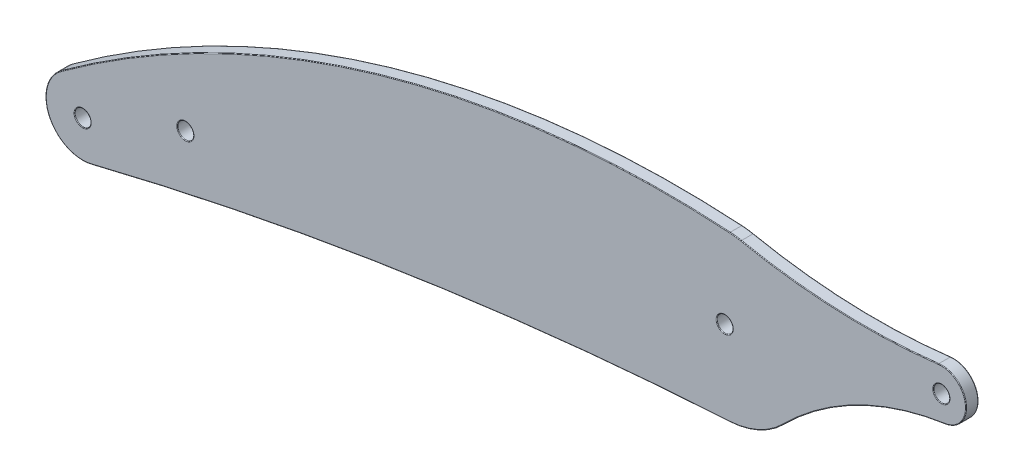
ISO-10303-21;
HEADER;
FILE_DESCRIPTION(('STEP AP214'),'2;1');
FILE_NAME('part.step','',(''),(''),'','','');
FILE_SCHEMA(('AUTOMOTIVE_DESIGN { 1 0 10303 214 1 1 1 1 }'));
ENDSEC;
DATA;
#1=APPLICATION_CONTEXT('core data for automotive mechanical design processes');
#2=APPLICATION_PROTOCOL_DEFINITION('international standard','automotive_design',2000,#1);
#3=PRODUCT_CONTEXT('',#1,'mechanical');
#4=PRODUCT('Part','Part','',(#3));
#5=PRODUCT_RELATED_PRODUCT_CATEGORY('part','',(#4));
#6=PRODUCT_DEFINITION_FORMATION('','',#4);
#7=PRODUCT_DEFINITION_CONTEXT('part definition',#1,'design');
#8=PRODUCT_DEFINITION('design','',#6,#7);
#9=PRODUCT_DEFINITION_SHAPE('','',#8);
#10=(LENGTH_UNIT() NAMED_UNIT(*) SI_UNIT(.MILLI.,.METRE.));
#11=(NAMED_UNIT(*) PLANE_ANGLE_UNIT() SI_UNIT($,.RADIAN.));
#12=(NAMED_UNIT(*) SI_UNIT($,.STERADIAN.) SOLID_ANGLE_UNIT());
#13=UNCERTAINTY_MEASURE_WITH_UNIT(LENGTH_MEASURE(1.E-05),#10,'distance_accuracy_value','');
#14=(GEOMETRIC_REPRESENTATION_CONTEXT(3) GLOBAL_UNCERTAINTY_ASSIGNED_CONTEXT((#13)) GLOBAL_UNIT_ASSIGNED_CONTEXT((#10,
#11,#12)) REPRESENTATION_CONTEXT('',''));
#15=CARTESIAN_POINT('',(0.,0.,0.));
#16=DIRECTION('',(0.,0.,1.));
#17=DIRECTION('',(1.,0.,0.));
#18=AXIS2_PLACEMENT_3D('',#15,#16,#17);
#19=CARTESIAN_POINT('',(-176.620485371218,170.937930838381,-3.));
#20=DIRECTION('',(0.,0.,1.));
#21=DIRECTION('',(1.,0.,0.));
#22=AXIS2_PLACEMENT_3D('',#19,#20,#21);
#23=CYLINDRICAL_SURFACE('',#22,9.00000000000001);
#24=DIRECTION('',(0.,0.,1.));
#25=VECTOR('',#24,1.);
#26=CARTESIAN_POINT('',(-174.462073608807,162.200582346768,-3.));
#27=LINE('',#26,#25);
#28=CARTESIAN_POINT('',(-174.462073608807,162.200582346768,-2.85));
#29=VERTEX_POINT('',#28);
#30=CARTESIAN_POINT('',(-174.462073608807,162.200582346768,-0.15));
#31=VERTEX_POINT('',#30);
#32=EDGE_CURVE('E277',#29,#31,#27,.T.);
#33=ORIENTED_EDGE('',*,*,#32,.T.);
#34=CARTESIAN_POINT('',(-176.620485371218,170.937930838381,-0.15));
#35=DIRECTION('',(0.,0.,1.));
#36=DIRECTION('',(1.,0.,0.));
#37=AXIS2_PLACEMENT_3D('',#34,#35,#36);
#38=CIRCLE('',#37,9.00000000000001);
#39=CARTESIAN_POINT('',(-181.91412724112,178.216485348256,-0.15));
#40=VERTEX_POINT('',#39);
#41=EDGE_CURVE('E210',#31,#40,#38,.F.);
#42=ORIENTED_EDGE('',*,*,#41,.T.);
#43=DIRECTION('',(0.,0.,1.));
#44=VECTOR('',#43,1.);
#45=CARTESIAN_POINT('',(-181.91412724112,178.216485348256,-3.));
#46=LINE('',#45,#44);
#47=CARTESIAN_POINT('',(-181.91412724112,178.216485348256,-2.85));
#48=VERTEX_POINT('',#47);
#49=EDGE_CURVE('E329',#48,#40,#46,.T.);
#50=ORIENTED_EDGE('',*,*,#49,.F.);
#51=CARTESIAN_POINT('',(-176.620485371218,170.937930838381,-2.85));
#52=DIRECTION('',(0.,0.,1.));
#53=DIRECTION('',(1.,0.,0.));
#54=AXIS2_PLACEMENT_3D('',#51,#52,#53);
#55=CIRCLE('',#54,9.00000000000001);
#56=EDGE_CURVE('E208',#48,#29,#55,.T.);
#57=ORIENTED_EDGE('',*,*,#56,.T.);
#58=EDGE_LOOP('',(#33,#42,#50,#57));
#59=FACE_BOUND('',#58,.T.);
#60=ADVANCED_FACE('F35',(#59),#23,.T.);
#61=CARTESIAN_POINT('',(-34.8685197438532,-23.9655843704996,-3.));
#62=DIRECTION('',(0.,0.,1.));
#63=DIRECTION('',(1.,0.,0.));
#64=AXIS2_PLACEMENT_3D('',#61,#62,#63);
#65=CYLINDRICAL_SURFACE('',#64,250.);
#66=ORIENTED_EDGE('',*,*,#49,.T.);
#67=CARTESIAN_POINT('',(-34.8685197438532,-23.9655843704996,-0.15));
#68=DIRECTION('',(0.,0.,1.));
#69=DIRECTION('',(1.,0.,0.));
#70=AXIS2_PLACEMENT_3D('',#67,#68,#69);
#71=CIRCLE('',#70,250.);
#72=CARTESIAN_POINT('',(-19.158929463068,225.540344964276,-0.15));
#73=VERTEX_POINT('',#72);
#74=EDGE_CURVE('E155',#40,#73,#71,.F.);
#75=ORIENTED_EDGE('',*,*,#74,.T.);
#76=DIRECTION('',(0.,0.,1.));
#77=VECTOR('',#76,1.);
#78=CARTESIAN_POINT('',(-19.158929463068,225.540344964276,-3.));
#79=LINE('',#78,#77);
#80=CARTESIAN_POINT('',(-19.158929463068,225.540344964276,-2.85));
#81=VERTEX_POINT('',#80);
#82=EDGE_CURVE('E375',#81,#73,#79,.T.);
#83=ORIENTED_EDGE('',*,*,#82,.F.);
#84=CARTESIAN_POINT('',(-34.8685197438532,-23.9655843704996,-2.85));
#85=DIRECTION('',(0.,0.,1.));
#86=DIRECTION('',(1.,0.,0.));
#87=AXIS2_PLACEMENT_3D('',#84,#85,#86);
#88=CIRCLE('',#87,250.);
#89=EDGE_CURVE('E175',#81,#48,#88,.T.);
#90=ORIENTED_EDGE('',*,*,#89,.T.);
#91=EDGE_LOOP('',(#66,#75,#83,#90));
#92=FACE_BOUND('',#91,.T.);
#93=ADVANCED_FACE('F374',(#92),#65,.T.);
#94=CARTESIAN_POINT('',(-20.4156966855308,205.579870617494,-3.));
#95=DIRECTION('',(0.,0.,1.));
#96=DIRECTION('',(1.,0.,0.));
#97=AXIS2_PLACEMENT_3D('',#94,#95,#96);
#98=CYLINDRICAL_SURFACE('',#97,20.);
#99=ORIENTED_EDGE('',*,*,#82,.T.);
#100=CARTESIAN_POINT('',(-20.4156966855308,205.579870617494,-0.15));
#101=DIRECTION('',(0.,0.,1.));
#102=DIRECTION('',(1.,0.,0.));
#103=AXIS2_PLACEMENT_3D('',#100,#101,#102);
#104=CIRCLE('',#103,20.);
#105=CARTESIAN_POINT('',(-16.4154020518036,225.175728415594,-0.15));
#106=VERTEX_POINT('',#105);
#107=EDGE_CURVE('E185',#73,#106,#104,.F.);
#108=ORIENTED_EDGE('',*,*,#107,.T.);
#109=DIRECTION('',(0.,0.,1.));
#110=VECTOR('',#109,1.);
#111=CARTESIAN_POINT('',(-16.4154020518036,225.175728415594,-3.));
#112=LINE('',#111,#110);
#113=CARTESIAN_POINT('',(-16.4154020518036,225.175728415594,-2.85));
#114=VERTEX_POINT('',#113);
#115=EDGE_CURVE('E377',#114,#106,#112,.T.);
#116=ORIENTED_EDGE('',*,*,#115,.F.);
#117=CARTESIAN_POINT('',(-20.4156966855308,205.579870617494,-2.85));
#118=DIRECTION('',(0.,0.,1.));
#119=DIRECTION('',(1.,0.,0.));
#120=AXIS2_PLACEMENT_3D('',#117,#118,#119);
#121=CIRCLE('',#120,20.);
#122=EDGE_CURVE('E183',#114,#81,#121,.T.);
#123=ORIENTED_EDGE('',*,*,#122,.T.);
#124=EDGE_LOOP('',(#99,#108,#116,#123));
#125=FACE_BOUND('',#124,.T.);
#126=ADVANCED_FACE('F376',(#125),#98,.T.);
#127=CARTESIAN_POINT('',(13.5868077011504,372.144661901347,-3.));
#128=DIRECTION('',(0.,0.,1.));
#129=DIRECTION('',(1.,0.,0.));
#130=AXIS2_PLACEMENT_3D('',#127,#128,#129);
#131=CYLINDRICAL_SURFACE('',#130,150.);
#132=ORIENTED_EDGE('',*,*,#115,.T.);
#133=CARTESIAN_POINT('',(13.5868077011504,372.144661901347,-0.15));
#134=DIRECTION('',(0.,0.,1.));
#135=DIRECTION('',(1.,0.,0.));
#136=AXIS2_PLACEMENT_3D('',#133,#134,#135);
#137=CIRCLE('',#136,150.);
#138=CARTESIAN_POINT('',(31.5835498114757,223.228184393267,-0.15));
#139=VERTEX_POINT('',#138);
#140=EDGE_CURVE('E189',#106,#139,#137,.T.);
#141=ORIENTED_EDGE('',*,*,#140,.T.);
#142=DIRECTION('',(0.,0.,1.));
#143=VECTOR('',#142,1.);
#144=CARTESIAN_POINT('',(31.5835498114757,223.228184393267,-3.));
#145=LINE('',#144,#143);
#146=CARTESIAN_POINT('',(31.5835498114757,223.228184393267,-2.85));
#147=VERTEX_POINT('',#146);
#148=EDGE_CURVE('E380',#147,#139,#145,.T.);
#149=ORIENTED_EDGE('',*,*,#148,.F.);
#150=CARTESIAN_POINT('',(13.5868077011504,372.144661901347,-2.85));
#151=DIRECTION('',(0.,0.,1.));
#152=DIRECTION('',(1.,0.,0.));
#153=AXIS2_PLACEMENT_3D('',#150,#151,#152);
#154=CIRCLE('',#153,150.);
#155=EDGE_CURVE('E187',#147,#114,#154,.F.);
#156=ORIENTED_EDGE('',*,*,#155,.T.);
#157=EDGE_LOOP('',(#132,#141,#149,#156));
#158=FACE_BOUND('',#157,.T.);
#159=ADVANCED_FACE('F506',(#158),#131,.F.);
#160=CARTESIAN_POINT('',(32.3034194958888,217.271525292944,-3.));
#161=DIRECTION('',(0.,0.,1.));
#162=DIRECTION('',(1.,0.,0.));
#163=AXIS2_PLACEMENT_3D('',#160,#161,#162);
#164=CYLINDRICAL_SURFACE('',#163,5.99999999999999);
#165=ORIENTED_EDGE('',*,*,#148,.T.);
#166=CARTESIAN_POINT('',(32.3034194958888,217.271525292944,-0.15));
#167=DIRECTION('',(0.,0.,1.));
#168=DIRECTION('',(1.,0.,0.));
#169=AXIS2_PLACEMENT_3D('',#166,#167,#168);
#170=CIRCLE('',#169,5.99999999999999);
#171=CARTESIAN_POINT('',(33.1766252443194,211.335406045413,-0.15));
#172=VERTEX_POINT('',#171);
#173=EDGE_CURVE('E193',#139,#172,#170,.F.);
#174=ORIENTED_EDGE('',*,*,#173,.T.);
#175=DIRECTION('',(0.,0.,1.));
#176=VECTOR('',#175,1.);
#177=CARTESIAN_POINT('',(33.1766252443194,211.335406045413,-3.));
#178=LINE('',#177,#176);
#179=CARTESIAN_POINT('',(33.1766252443194,211.335406045413,-2.85));
#180=VERTEX_POINT('',#179);
#181=EDGE_CURVE('E385',#180,#172,#178,.T.);
#182=ORIENTED_EDGE('',*,*,#181,.F.);
#183=CARTESIAN_POINT('',(32.3034194958888,217.271525292944,-2.85));
#184=DIRECTION('',(0.,0.,1.));
#185=DIRECTION('',(1.,0.,0.));
#186=AXIS2_PLACEMENT_3D('',#183,#184,#185);
#187=CIRCLE('',#186,5.99999999999999);
#188=EDGE_CURVE('E191',#180,#147,#187,.T.);
#189=ORIENTED_EDGE('',*,*,#188,.T.);
#190=EDGE_LOOP('',(#165,#174,#182,#189));
#191=FACE_BOUND('',#190,.T.);
#192=ADVANCED_FACE('F412',(#191),#164,.T.);
#193=CARTESIAN_POINT('',(43.3640256426764,142.080681490885,-3.));
#194=DIRECTION('',(0.,0.,1.));
#195=DIRECTION('',(1.,0.,0.));
#196=AXIS2_PLACEMENT_3D('',#193,#194,#195);
#197=CYLINDRICAL_SURFACE('',#196,70.);
#198=ORIENTED_EDGE('',*,*,#181,.T.);
#199=CARTESIAN_POINT('',(43.3640256426764,142.080681490885,-0.15));
#200=DIRECTION('',(0.,0.,1.));
#201=DIRECTION('',(1.,0.,0.));
#202=AXIS2_PLACEMENT_3D('',#199,#200,#201);
#203=CIRCLE('',#202,70.);
#204=CARTESIAN_POINT('',(-6.24242505704032,191.46893970047,-0.15));
#205=VERTEX_POINT('',#204);
#206=EDGE_CURVE('E197',#172,#205,#203,.T.);
#207=ORIENTED_EDGE('',*,*,#206,.T.);
#208=DIRECTION('',(0.,0.,1.));
#209=VECTOR('',#208,1.);
#210=CARTESIAN_POINT('',(-6.24242505704032,191.46893970047,-3.));
#211=LINE('',#210,#209);
#212=CARTESIAN_POINT('',(-6.24242505704032,191.46893970047,-2.85));
#213=VERTEX_POINT('',#212);
#214=EDGE_CURVE('E337',#213,#205,#211,.T.);
#215=ORIENTED_EDGE('',*,*,#214,.F.);
#216=CARTESIAN_POINT('',(43.3640256426764,142.080681490885,-2.85));
#217=DIRECTION('',(0.,0.,1.));
#218=DIRECTION('',(1.,0.,0.));
#219=AXIS2_PLACEMENT_3D('',#216,#217,#218);
#220=CIRCLE('',#219,70.);
#221=EDGE_CURVE('E195',#213,#180,#220,.F.);
#222=ORIENTED_EDGE('',*,*,#221,.T.);
#223=EDGE_LOOP('',(#198,#207,#215,#222));
#224=FACE_BOUND('',#223,.T.);
#225=ADVANCED_FACE('F414',(#224),#197,.F.);
#226=CARTESIAN_POINT('',(-20.4156966855308,205.579870617494,-3.));
#227=DIRECTION('',(0.,0.,1.));
#228=DIRECTION('',(1.,0.,0.));
#229=AXIS2_PLACEMENT_3D('',#226,#227,#228);
#230=CYLINDRICAL_SURFACE('',#229,19.9999999999999);
#231=ORIENTED_EDGE('',*,*,#214,.T.);
#232=CARTESIAN_POINT('',(-20.4156966855308,205.579870617494,-0.15));
#233=DIRECTION('',(0.,0.,1.));
#234=DIRECTION('',(1.,0.,0.));
#235=AXIS2_PLACEMENT_3D('',#232,#233,#234);
#236=CIRCLE('',#235,19.9999999999999);
#237=CARTESIAN_POINT('',(-19.2707858151859,185.612668031779,-0.15));
#238=VERTEX_POINT('',#237);
#239=EDGE_CURVE('E201',#205,#238,#236,.F.);
#240=ORIENTED_EDGE('',*,*,#239,.T.);
#241=DIRECTION('',(0.,0.,1.));
#242=VECTOR('',#241,1.);
#243=CARTESIAN_POINT('',(-19.2707858151859,185.612668031779,-3.));
#244=LINE('',#243,#242);
#245=CARTESIAN_POINT('',(-19.2707858151859,185.612668031779,-2.85));
#246=VERTEX_POINT('',#245);
#247=EDGE_CURVE('E335',#246,#238,#244,.T.);
#248=ORIENTED_EDGE('',*,*,#247,.F.);
#249=CARTESIAN_POINT('',(-20.4156966855308,205.579870617494,-2.85));
#250=DIRECTION('',(0.,0.,1.));
#251=DIRECTION('',(1.,0.,0.));
#252=AXIS2_PLACEMENT_3D('',#249,#250,#251);
#253=CIRCLE('',#252,19.9999999999999);
#254=EDGE_CURVE('E199',#246,#213,#253,.T.);
#255=ORIENTED_EDGE('',*,*,#254,.T.);
#256=EDGE_LOOP('',(#231,#240,#248,#255));
#257=FACE_BOUND('',#256,.T.);
#258=ADVANCED_FACE('F391',(#257),#230,.T.);
#259=CARTESIAN_POINT('',(29.3879261744673,-662.99344186109,-3.));
#260=DIRECTION('',(0.,0.,1.));
#261=DIRECTION('',(1.,0.,0.));
#262=AXIS2_PLACEMENT_3D('',#259,#260,#261);
#263=CYLINDRICAL_SURFACE('',#262,850.);
#264=ORIENTED_EDGE('',*,*,#247,.T.);
#265=CARTESIAN_POINT('',(29.3879261744673,-662.99344186109,-0.15));
#266=DIRECTION('',(0.,0.,1.));
#267=DIRECTION('',(1.,0.,0.));
#268=AXIS2_PLACEMENT_3D('',#265,#266,#267);
#269=CIRCLE('',#268,850.);
#270=EDGE_CURVE('E206',#238,#31,#269,.T.);
#271=ORIENTED_EDGE('',*,*,#270,.T.);
#272=ORIENTED_EDGE('',*,*,#32,.F.);
#273=CARTESIAN_POINT('',(29.3879261744673,-662.99344186109,-2.85));
#274=DIRECTION('',(0.,0.,1.));
#275=DIRECTION('',(1.,0.,0.));
#276=AXIS2_PLACEMENT_3D('',#273,#274,#275);
#277=CIRCLE('',#276,850.);
#278=EDGE_CURVE('E203',#29,#246,#277,.F.);
#279=ORIENTED_EDGE('',*,*,#278,.T.);
#280=EDGE_LOOP('',(#264,#271,#272,#279));
#281=FACE_BOUND('',#280,.T.);
#282=ADVANCED_FACE('F332',(#281),#263,.F.);
#283=CARTESIAN_POINT('',(-73.6162795983756,-246.027755511355,-3.));
#284=DIRECTION('',(0.,0.,1.));
#285=DIRECTION('',(1.,0.,0.));
#286=AXIS2_PLACEMENT_3D('',#283,#284,#285);
#287=PLANE('',#286);
#288=CARTESIAN_POINT('',(-20.4156966855308,205.579870617494,-3.));
#289=DIRECTION('',(0.,0.,1.));
#290=DIRECTION('',(1.,0.,0.));
#291=AXIS2_PLACEMENT_3D('',#288,#289,#290);
#292=CIRCLE('',#291,19.8499999999999);
#293=CARTESIAN_POINT('',(-6.34872459425398,191.574771682347,-3.));
#294=VERTEX_POINT('',#293);
#295=CARTESIAN_POINT('',(-19.2793726467135,185.762422051172,-3.));
#296=VERTEX_POINT('',#295);
#297=EDGE_CURVE('E44',#294,#296,#292,.F.);
#298=ORIENTED_EDGE('',*,*,#297,.T.);
#299=CARTESIAN_POINT('',(29.3879261744673,-662.99344186109,-3.));
#300=DIRECTION('',(0.,0.,1.));
#301=DIRECTION('',(1.,0.,0.));
#302=AXIS2_PLACEMENT_3D('',#299,#300,#301);
#303=CIRCLE('',#302,850.15);
#304=CARTESIAN_POINT('',(-174.498047138181,162.346204821628,-3.));
#305=VERTEX_POINT('',#304);
#306=EDGE_CURVE('E11',#296,#305,#303,.T.);
#307=ORIENTED_EDGE('',*,*,#306,.T.);
#308=CARTESIAN_POINT('',(-176.620485371218,170.937930838381,-3.));
#309=DIRECTION('',(0.,0.,1.));
#310=DIRECTION('',(1.,0.,0.));
#311=AXIS2_PLACEMENT_3D('',#308,#309,#310);
#312=CIRCLE('',#311,8.85);
#313=CARTESIAN_POINT('',(-181.825899876622,178.095176106425,-3.));
#314=VERTEX_POINT('',#313);
#315=EDGE_CURVE('E248',#305,#314,#312,.F.);
#316=ORIENTED_EDGE('',*,*,#315,.T.);
#317=CARTESIAN_POINT('',(-34.8685197438532,-23.9655843704996,-3.));
#318=DIRECTION('',(0.,0.,1.));
#319=DIRECTION('',(1.,0.,0.));
#320=AXIS2_PLACEMENT_3D('',#317,#318,#319);
#321=CIRCLE('',#320,249.85);
#322=CARTESIAN_POINT('',(-19.1683552172364,225.390641406675,-3.));
#323=VERTEX_POINT('',#322);
#324=EDGE_CURVE('E250',#314,#323,#321,.F.);
#325=ORIENTED_EDGE('',*,*,#324,.T.);
#326=CARTESIAN_POINT('',(-20.4156966855308,205.579870617494,-3.));
#327=DIRECTION('',(0.,0.,1.));
#328=DIRECTION('',(1.,0.,0.));
#329=AXIS2_PLACEMENT_3D('',#326,#327,#328);
#330=CIRCLE('',#329,19.85);
#331=CARTESIAN_POINT('',(-16.4454042615566,225.028759482108,-3.));
#332=VERTEX_POINT('',#331);
#333=EDGE_CURVE('E252',#323,#332,#330,.F.);
#334=ORIENTED_EDGE('',*,*,#333,.T.);
#335=CARTESIAN_POINT('',(13.5868077011504,372.144661901347,-3.));
#336=DIRECTION('',(0.,0.,1.));
#337=DIRECTION('',(1.,0.,0.));
#338=AXIS2_PLACEMENT_3D('',#335,#336,#337);
#339=CIRCLE('',#338,150.15);
#340=CARTESIAN_POINT('',(31.6015465535861,223.079267915759,-3.));
#341=VERTEX_POINT('',#340);
#342=EDGE_CURVE('E254',#332,#341,#339,.T.);
#343=ORIENTED_EDGE('',*,*,#342,.T.);
#344=CARTESIAN_POINT('',(32.3034194958888,217.271525292944,-3.));
#345=DIRECTION('',(0.,0.,1.));
#346=DIRECTION('',(1.,0.,0.));
#347=AXIS2_PLACEMENT_3D('',#344,#345,#346);
#348=CIRCLE('',#347,5.84999999999999);
#349=CARTESIAN_POINT('',(33.1547951006086,211.483809026602,-3.));
#350=VERTEX_POINT('',#349);
#351=EDGE_CURVE('E256',#341,#350,#348,.F.);
#352=ORIENTED_EDGE('',*,*,#351,.T.);
#353=CARTESIAN_POINT('',(43.3640256426764,142.080681490885,-3.));
#354=DIRECTION('',(0.,0.,1.));
#355=DIRECTION('',(1.,0.,0.));
#356=AXIS2_PLACEMENT_3D('',#353,#354,#355);
#357=CIRCLE('',#356,70.15);
#358=EDGE_CURVE('E55',#350,#294,#357,.T.);
#359=ORIENTED_EDGE('',*,*,#358,.T.);
#360=EDGE_LOOP('',(#298,#307,#316,#325,#334,#343,#352,#359));
#361=FACE_BOUND('',#360,.T.);
#362=CARTESIAN_POINT('',(-176.620485371218,170.937930838381,-3.));
#363=DIRECTION('',(0.,0.,1.));
#364=DIRECTION('',(1.,0.,0.));
#365=AXIS2_PLACEMENT_3D('',#362,#363,#364);
#366=CIRCLE('',#365,2.09999999999998);
#367=CARTESIAN_POINT('',(-174.520485371218,170.937930838381,-3.));
#368=VERTEX_POINT('',#367);
#369=EDGE_CURVE('E245',#368,#368,#366,.T.);
#370=ORIENTED_EDGE('',*,*,#369,.T.);
#371=EDGE_LOOP('',(#370));
#372=FACE_BOUND('',#371,.T.);
#373=CARTESIAN_POINT('',(-151.620485371218,180.705519261368,-3.));
#374=DIRECTION('',(0.,0.,1.));
#375=DIRECTION('',(1.,0.,0.));
#376=AXIS2_PLACEMENT_3D('',#373,#374,#375);
#377=CIRCLE('',#376,2.09999999999998);
#378=CARTESIAN_POINT('',(-149.520485371218,180.705519261368,-3.));
#379=VERTEX_POINT('',#378);
#380=EDGE_CURVE('E242',#379,#379,#377,.T.);
#381=ORIENTED_EDGE('',*,*,#380,.T.);
#382=EDGE_LOOP('',(#381));
#383=FACE_BOUND('',#382,.T.);
#384=CARTESIAN_POINT('',(-20.4156966855308,205.579870617494,-3.));
#385=DIRECTION('',(0.,0.,1.));
#386=DIRECTION('',(1.,0.,0.));
#387=AXIS2_PLACEMENT_3D('',#384,#385,#386);
#388=CIRCLE('',#387,2.09999999999999);
#389=CARTESIAN_POINT('',(-18.3156966855308,205.579870617494,-3.));
#390=VERTEX_POINT('',#389);
#391=EDGE_CURVE('E239',#390,#390,#388,.T.);
#392=ORIENTED_EDGE('',*,*,#391,.T.);
#393=EDGE_LOOP('',(#392));
#394=FACE_BOUND('',#393,.T.);
#395=CARTESIAN_POINT('',(32.3034194958888,217.271525292944,-3.));
#396=DIRECTION('',(0.,0.,1.));
#397=DIRECTION('',(1.,0.,0.));
#398=AXIS2_PLACEMENT_3D('',#395,#396,#397);
#399=CIRCLE('',#398,2.09999999999999);
#400=CARTESIAN_POINT('',(34.4034194958888,217.271525292944,-3.));
#401=VERTEX_POINT('',#400);
#402=EDGE_CURVE('E236',#401,#401,#399,.T.);
#403=ORIENTED_EDGE('',*,*,#402,.T.);
#404=EDGE_LOOP('',(#403));
#405=FACE_BOUND('',#404,.T.);
#406=ADVANCED_FACE('F310',(#361,#372,#383,#394,#405),#287,.F.);
#407=CARTESIAN_POINT('',(-73.6162795983756,-246.027755511355,0.));
#408=DIRECTION('',(0.,0.,1.));
#409=DIRECTION('',(1.,0.,0.));
#410=AXIS2_PLACEMENT_3D('',#407,#408,#409);
#411=PLANE('',#410);
#412=CARTESIAN_POINT('',(-20.4156966855308,205.579870617494,0.));
#413=DIRECTION('',(0.,0.,1.));
#414=DIRECTION('',(1.,0.,0.));
#415=AXIS2_PLACEMENT_3D('',#412,#413,#414);
#416=CIRCLE('',#415,19.85);
#417=CARTESIAN_POINT('',(-16.4454042615566,225.028759482108,0.));
#418=VERTEX_POINT('',#417);
#419=CARTESIAN_POINT('',(-19.1683552172364,225.390641406675,0.));
#420=VERTEX_POINT('',#419);
#421=EDGE_CURVE('E173',#418,#420,#416,.T.);
#422=ORIENTED_EDGE('',*,*,#421,.T.);
#423=CARTESIAN_POINT('',(-34.8685197438532,-23.9655843704996,0.));
#424=DIRECTION('',(0.,0.,1.));
#425=DIRECTION('',(1.,0.,0.));
#426=AXIS2_PLACEMENT_3D('',#423,#424,#425);
#427=CIRCLE('',#426,249.85);
#428=CARTESIAN_POINT('',(-181.825899876622,178.095176106425,0.));
#429=VERTEX_POINT('',#428);
#430=EDGE_CURVE('E153',#420,#429,#427,.T.);
#431=ORIENTED_EDGE('',*,*,#430,.T.);
#432=CARTESIAN_POINT('',(-176.620485371218,170.937930838381,0.));
#433=DIRECTION('',(0.,0.,1.));
#434=DIRECTION('',(1.,0.,0.));
#435=AXIS2_PLACEMENT_3D('',#432,#433,#434);
#436=CIRCLE('',#435,8.85);
#437=CARTESIAN_POINT('',(-174.498047138181,162.346204821628,0.));
#438=VERTEX_POINT('',#437);
#439=EDGE_CURVE('E161',#429,#438,#436,.T.);
#440=ORIENTED_EDGE('',*,*,#439,.T.);
#441=CARTESIAN_POINT('',(29.3879261744673,-662.99344186109,0.));
#442=DIRECTION('',(0.,0.,1.));
#443=DIRECTION('',(1.,0.,0.));
#444=AXIS2_PLACEMENT_3D('',#441,#442,#443);
#445=CIRCLE('',#444,850.15);
#446=CARTESIAN_POINT('',(-19.2793726467135,185.762422051172,0.));
#447=VERTEX_POINT('',#446);
#448=EDGE_CURVE('E167',#438,#447,#445,.F.);
#449=ORIENTED_EDGE('',*,*,#448,.T.);
#450=CARTESIAN_POINT('',(-20.4156966855308,205.579870617494,0.));
#451=DIRECTION('',(0.,0.,1.));
#452=DIRECTION('',(1.,0.,0.));
#453=AXIS2_PLACEMENT_3D('',#450,#451,#452);
#454=CIRCLE('',#453,19.8499999999999);
#455=CARTESIAN_POINT('',(-6.348724594254,191.574771682347,0.));
#456=VERTEX_POINT('',#455);
#457=EDGE_CURVE('E353',#447,#456,#454,.T.);
#458=ORIENTED_EDGE('',*,*,#457,.T.);
#459=CARTESIAN_POINT('',(43.3640256426764,142.080681490885,0.));
#460=DIRECTION('',(0.,0.,1.));
#461=DIRECTION('',(1.,0.,0.));
#462=AXIS2_PLACEMENT_3D('',#459,#460,#461);
#463=CIRCLE('',#462,70.15);
#464=CARTESIAN_POINT('',(33.1547951006086,211.483809026602,0.));
#465=VERTEX_POINT('',#464);
#466=EDGE_CURVE('E355',#456,#465,#463,.F.);
#467=ORIENTED_EDGE('',*,*,#466,.T.);
#468=CARTESIAN_POINT('',(32.3034194958888,217.271525292944,0.));
#469=DIRECTION('',(0.,0.,1.));
#470=DIRECTION('',(1.,0.,0.));
#471=AXIS2_PLACEMENT_3D('',#468,#469,#470);
#472=CIRCLE('',#471,5.84999999999999);
#473=CARTESIAN_POINT('',(31.6015465535861,223.079267915759,0.));
#474=VERTEX_POINT('',#473);
#475=EDGE_CURVE('E357',#465,#474,#472,.T.);
#476=ORIENTED_EDGE('',*,*,#475,.T.);
#477=CARTESIAN_POINT('',(13.5868077011504,372.144661901347,0.));
#478=DIRECTION('',(0.,0.,1.));
#479=DIRECTION('',(1.,0.,0.));
#480=AXIS2_PLACEMENT_3D('',#477,#478,#479);
#481=CIRCLE('',#480,150.15);
#482=EDGE_CURVE('E178',#474,#418,#481,.F.);
#483=ORIENTED_EDGE('',*,*,#482,.T.);
#484=EDGE_LOOP('',(#422,#431,#440,#449,#458,#467,#476,#483));
#485=FACE_BOUND('',#484,.T.);
#486=CARTESIAN_POINT('',(-176.620485371218,170.937930838381,0.));
#487=DIRECTION('',(0.,0.,1.));
#488=DIRECTION('',(1.,0.,0.));
#489=AXIS2_PLACEMENT_3D('',#486,#487,#488);
#490=CIRCLE('',#489,2.09999999999998);
#491=CARTESIAN_POINT('',(-174.520485371218,170.937930838381,0.));
#492=VERTEX_POINT('',#491);
#493=EDGE_CURVE('E168',#492,#492,#490,.F.);
#494=ORIENTED_EDGE('',*,*,#493,.T.);
#495=EDGE_LOOP('',(#494));
#496=FACE_BOUND('',#495,.T.);
#497=CARTESIAN_POINT('',(-151.620485371218,180.705519261368,0.));
#498=DIRECTION('',(0.,0.,1.));
#499=DIRECTION('',(1.,0.,0.));
#500=AXIS2_PLACEMENT_3D('',#497,#498,#499);
#501=CIRCLE('',#500,2.09999999999998);
#502=CARTESIAN_POINT('',(-149.520485371218,180.705519261368,0.));
#503=VERTEX_POINT('',#502);
#504=EDGE_CURVE('E347',#503,#503,#501,.F.);
#505=ORIENTED_EDGE('',*,*,#504,.T.);
#506=EDGE_LOOP('',(#505));
#507=FACE_BOUND('',#506,.T.);
#508=CARTESIAN_POINT('',(-20.4156966855308,205.579870617494,0.));
#509=DIRECTION('',(0.,0.,1.));
#510=DIRECTION('',(1.,0.,0.));
#511=AXIS2_PLACEMENT_3D('',#508,#509,#510);
#512=CIRCLE('',#511,2.09999999999999);
#513=CARTESIAN_POINT('',(-18.3156966855308,205.579870617494,0.));
#514=VERTEX_POINT('',#513);
#515=EDGE_CURVE('E344',#514,#514,#512,.F.);
#516=ORIENTED_EDGE('',*,*,#515,.T.);
#517=EDGE_LOOP('',(#516));
#518=FACE_BOUND('',#517,.T.);
#519=CARTESIAN_POINT('',(32.3034194958888,217.271525292944,0.));
#520=DIRECTION('',(0.,0.,1.));
#521=DIRECTION('',(1.,0.,0.));
#522=AXIS2_PLACEMENT_3D('',#519,#520,#521);
#523=CIRCLE('',#522,2.09999999999999);
#524=CARTESIAN_POINT('',(34.4034194958888,217.271525292944,0.));
#525=VERTEX_POINT('',#524);
#526=EDGE_CURVE('E341',#525,#525,#523,.F.);
#527=ORIENTED_EDGE('',*,*,#526,.T.);
#528=EDGE_LOOP('',(#527));
#529=FACE_BOUND('',#528,.T.);
#530=ADVANCED_FACE('F170',(#485,#496,#507,#518,#529),#411,.T.);
#531=CARTESIAN_POINT('',(-176.620485371218,170.937930838381,0.));
#532=DIRECTION('',(0.,0.,1.));
#533=DIRECTION('',(1.,0.,0.));
#534=AXIS2_PLACEMENT_3D('',#531,#532,#533);
#535=CYLINDRICAL_SURFACE('',#534,1.94999999999998);
#536=CARTESIAN_POINT('',(-176.620485371218,170.937930838381,-0.15));
#537=DIRECTION('',(0.,0.,1.));
#538=DIRECTION('',(1.,0.,0.));
#539=AXIS2_PLACEMENT_3D('',#536,#537,#538);
#540=CIRCLE('',#539,1.94999999999998);
#541=CARTESIAN_POINT('',(-174.670485371218,170.937930838381,-0.15));
#542=VERTEX_POINT('',#541);
#543=EDGE_CURVE('E215',#542,#542,#540,.T.);
#544=ORIENTED_EDGE('',*,*,#543,.T.);
#545=EDGE_LOOP('',(#544));
#546=FACE_BOUND('',#545,.T.);
#547=CARTESIAN_POINT('',(-176.620485371218,170.937930838381,-2.85));
#548=DIRECTION('',(0.,0.,1.));
#549=DIRECTION('',(1.,0.,0.));
#550=AXIS2_PLACEMENT_3D('',#547,#548,#549);
#551=CIRCLE('',#550,1.94999999999998);
#552=CARTESIAN_POINT('',(-174.670485371218,170.937930838381,-2.85));
#553=VERTEX_POINT('',#552);
#554=EDGE_CURVE('E212',#553,#553,#551,.F.);
#555=ORIENTED_EDGE('',*,*,#554,.T.);
#556=EDGE_LOOP('',(#555));
#557=FACE_BOUND('',#556,.T.);
#558=ADVANCED_FACE('F499',(#546,#557),#535,.F.);
#559=CARTESIAN_POINT('',(-151.620485371218,180.705519261368,0.));
#560=DIRECTION('',(0.,0.,1.));
#561=DIRECTION('',(1.,0.,0.));
#562=AXIS2_PLACEMENT_3D('',#559,#560,#561);
#563=CYLINDRICAL_SURFACE('',#562,1.94999999999998);
#564=CARTESIAN_POINT('',(-151.620485371218,180.705519261368,-0.15));
#565=DIRECTION('',(0.,0.,1.));
#566=DIRECTION('',(1.,0.,0.));
#567=AXIS2_PLACEMENT_3D('',#564,#565,#566);
#568=CIRCLE('',#567,1.94999999999998);
#569=CARTESIAN_POINT('',(-149.670485371218,180.705519261368,-0.15));
#570=VERTEX_POINT('',#569);
#571=EDGE_CURVE('E221',#570,#570,#568,.T.);
#572=ORIENTED_EDGE('',*,*,#571,.T.);
#573=EDGE_LOOP('',(#572));
#574=FACE_BOUND('',#573,.T.);
#575=CARTESIAN_POINT('',(-151.620485371218,180.705519261368,-2.85));
#576=DIRECTION('',(0.,0.,1.));
#577=DIRECTION('',(1.,0.,0.));
#578=AXIS2_PLACEMENT_3D('',#575,#576,#577);
#579=CIRCLE('',#578,1.94999999999998);
#580=CARTESIAN_POINT('',(-149.670485371218,180.705519261368,-2.85));
#581=VERTEX_POINT('',#580);
#582=EDGE_CURVE('E218',#581,#581,#579,.F.);
#583=ORIENTED_EDGE('',*,*,#582,.T.);
#584=EDGE_LOOP('',(#583));
#585=FACE_BOUND('',#584,.T.);
#586=ADVANCED_FACE('F542',(#574,#585),#563,.F.);
#587=CARTESIAN_POINT('',(-20.4156966855308,205.579870617494,0.));
#588=DIRECTION('',(0.,0.,1.));
#589=DIRECTION('',(1.,0.,0.));
#590=AXIS2_PLACEMENT_3D('',#587,#588,#589);
#591=CYLINDRICAL_SURFACE('',#590,1.94999999999999);
#592=CARTESIAN_POINT('',(-20.4156966855308,205.579870617494,-0.15));
#593=DIRECTION('',(0.,0.,1.));
#594=DIRECTION('',(1.,0.,0.));
#595=AXIS2_PLACEMENT_3D('',#592,#593,#594);
#596=CIRCLE('',#595,1.94999999999999);
#597=CARTESIAN_POINT('',(-18.4656966855308,205.579870617494,-0.15));
#598=VERTEX_POINT('',#597);
#599=EDGE_CURVE('E227',#598,#598,#596,.T.);
#600=ORIENTED_EDGE('',*,*,#599,.T.);
#601=EDGE_LOOP('',(#600));
#602=FACE_BOUND('',#601,.T.);
#603=CARTESIAN_POINT('',(-20.4156966855308,205.579870617494,-2.85));
#604=DIRECTION('',(0.,0.,1.));
#605=DIRECTION('',(1.,0.,0.));
#606=AXIS2_PLACEMENT_3D('',#603,#604,#605);
#607=CIRCLE('',#606,1.94999999999999);
#608=CARTESIAN_POINT('',(-18.4656966855308,205.579870617494,-2.85));
#609=VERTEX_POINT('',#608);
#610=EDGE_CURVE('E224',#609,#609,#607,.F.);
#611=ORIENTED_EDGE('',*,*,#610,.T.);
#612=EDGE_LOOP('',(#611));
#613=FACE_BOUND('',#612,.T.);
#614=ADVANCED_FACE('F484',(#602,#613),#591,.F.);
#615=CARTESIAN_POINT('',(32.3034194958888,217.271525292944,0.));
#616=DIRECTION('',(0.,0.,1.));
#617=DIRECTION('',(1.,0.,0.));
#618=AXIS2_PLACEMENT_3D('',#615,#616,#617);
#619=CYLINDRICAL_SURFACE('',#618,1.94999999999999);
#620=CARTESIAN_POINT('',(32.3034194958888,217.271525292944,-0.15));
#621=DIRECTION('',(0.,0.,1.));
#622=DIRECTION('',(1.,0.,0.));
#623=AXIS2_PLACEMENT_3D('',#620,#621,#622);
#624=CIRCLE('',#623,1.94999999999999);
#625=CARTESIAN_POINT('',(34.2534194958888,217.271525292944,-0.15));
#626=VERTEX_POINT('',#625);
#627=EDGE_CURVE('E233',#626,#626,#624,.T.);
#628=ORIENTED_EDGE('',*,*,#627,.T.);
#629=EDGE_LOOP('',(#628));
#630=FACE_BOUND('',#629,.T.);
#631=CARTESIAN_POINT('',(32.3034194958888,217.271525292944,-2.85));
#632=DIRECTION('',(0.,0.,1.));
#633=DIRECTION('',(1.,0.,0.));
#634=AXIS2_PLACEMENT_3D('',#631,#632,#633);
#635=CIRCLE('',#634,1.94999999999999);
#636=CARTESIAN_POINT('',(34.2534194958888,217.271525292944,-2.85));
#637=VERTEX_POINT('',#636);
#638=EDGE_CURVE('E230',#637,#637,#635,.F.);
#639=ORIENTED_EDGE('',*,*,#638,.T.);
#640=EDGE_LOOP('',(#639));
#641=FACE_BOUND('',#640,.T.);
#642=ADVANCED_FACE('F460',(#630,#641),#619,.F.);
#643=CARTESIAN_POINT('',(43.3640256426764,142.080681490885,-0.15));
#644=DIRECTION('',(0.,0.,1.));
#645=DIRECTION('',(1.,0.,0.));
#646=AXIS2_PLACEMENT_3D('',#643,#644,#645);
#647=TOROIDAL_SURFACE('',#646,70.15,0.15);
#648=CARTESIAN_POINT('',(-6.34872459425398,191.574771682347,-0.15));
#649=DIRECTION('',(-0.705546545851239,-0.708663581424491,0.));
#650=DIRECTION('',(0.708663581424491,-0.705546545851239,0.));
#651=AXIS2_PLACEMENT_3D('',#648,#649,#650);
#652=CIRCLE('',#651,0.15);
#653=EDGE_CURVE('E271',#205,#456,#652,.T.);
#654=ORIENTED_EDGE('',*,*,#653,.F.);
#655=ORIENTED_EDGE('',*,*,#206,.F.);
#656=CARTESIAN_POINT('',(33.1547951006086,211.483809026602,-0.15));
#657=DIRECTION('',(0.989353207921827,0.145534291405119,0.));
#658=DIRECTION('',(-0.145534291405119,0.989353207921827,0.));
#659=AXIS2_PLACEMENT_3D('',#656,#657,#658);
#660=CIRCLE('',#659,0.15);
#661=EDGE_CURVE('E274',#465,#172,#660,.T.);
#662=ORIENTED_EDGE('',*,*,#661,.F.);
#663=ORIENTED_EDGE('',*,*,#466,.F.);
#664=EDGE_LOOP('',(#654,#655,#662,#663));
#665=FACE_BOUND('',#664,.T.);
#666=ADVANCED_FACE('F399',(#665),#647,.T.);
#667=CARTESIAN_POINT('',(32.3034194958888,217.271525292944,-0.15));
#668=DIRECTION('',(0.,0.,1.));
#669=DIRECTION('',(1.,0.,0.));
#670=AXIS2_PLACEMENT_3D('',#667,#668,#669);
#671=TOROIDAL_SURFACE('',#670,5.84999999999999,0.15);
#672=ORIENTED_EDGE('',*,*,#661,.T.);
#673=ORIENTED_EDGE('',*,*,#173,.F.);
#674=CARTESIAN_POINT('',(31.6015465535861,223.079267915759,-0.15));
#675=DIRECTION('',(-0.992776516720534,-0.119978280735486,0.));
#676=DIRECTION('',(0.119978280735486,-0.992776516720534,0.));
#677=AXIS2_PLACEMENT_3D('',#674,#675,#676);
#678=CIRCLE('',#677,0.15);
#679=EDGE_CURVE('E268',#474,#139,#678,.T.);
#680=ORIENTED_EDGE('',*,*,#679,.F.);
#681=ORIENTED_EDGE('',*,*,#475,.F.);
#682=EDGE_LOOP('',(#672,#673,#680,#681));
#683=FACE_BOUND('',#682,.T.);
#684=ADVANCED_FACE('F409',(#683),#671,.T.);
#685=CARTESIAN_POINT('',(-20.4156966855308,205.579870617494,-0.15));
#686=DIRECTION('',(0.,0.,1.));
#687=DIRECTION('',(1.,0.,0.));
#688=AXIS2_PLACEMENT_3D('',#685,#686,#687);
#689=TOROIDAL_SURFACE('',#688,19.8499999999999,0.15);
#690=ORIENTED_EDGE('',*,*,#653,.T.);
#691=ORIENTED_EDGE('',*,*,#457,.F.);
#692=CARTESIAN_POINT('',(-19.2793726467135,185.762422051172,-0.15));
#693=DIRECTION('',(-0.998360129285727,-0.0572455435172551,0.));
#694=DIRECTION('',(0.0572455435172551,-0.998360129285727,0.));
#695=AXIS2_PLACEMENT_3D('',#692,#693,#694);
#696=CIRCLE('',#695,0.15);
#697=EDGE_CURVE('E265',#238,#447,#696,.T.);
#698=ORIENTED_EDGE('',*,*,#697,.F.);
#699=ORIENTED_EDGE('',*,*,#239,.F.);
#700=EDGE_LOOP('',(#690,#691,#698,#699));
#701=FACE_BOUND('',#700,.T.);
#702=ADVANCED_FACE('F404',(#701),#689,.T.);
#703=CARTESIAN_POINT('',(13.5868077011504,372.144661901347,-0.15));
#704=DIRECTION('',(0.,0.,1.));
#705=DIRECTION('',(1.,0.,0.));
#706=AXIS2_PLACEMENT_3D('',#703,#704,#705);
#707=TOROIDAL_SURFACE('',#706,150.15,0.15);
#708=ORIENTED_EDGE('',*,*,#679,.T.);
#709=ORIENTED_EDGE('',*,*,#140,.F.);
#710=CARTESIAN_POINT('',(-16.4454042615566,225.028759482108,-0.15));
#711=DIRECTION('',(-0.979792889905032,0.200014731686306,0.));
#712=DIRECTION('',(-0.200014731686306,-0.979792889905033,0.));
#713=AXIS2_PLACEMENT_3D('',#710,#711,#712);
#714=CIRCLE('',#713,0.15);
#715=EDGE_CURVE('E262',#418,#106,#714,.T.);
#716=ORIENTED_EDGE('',*,*,#715,.F.);
#717=ORIENTED_EDGE('',*,*,#482,.F.);
#718=EDGE_LOOP('',(#708,#709,#716,#717));
#719=FACE_BOUND('',#718,.T.);
#720=ADVANCED_FACE('F364',(#719),#707,.T.);
#721=CARTESIAN_POINT('',(29.3879261744673,-662.99344186109,-0.15));
#722=DIRECTION('',(0.,0.,1.));
#723=DIRECTION('',(1.,0.,0.));
#724=AXIS2_PLACEMENT_3D('',#721,#722,#723);
#725=TOROIDAL_SURFACE('',#724,850.15,0.15);
#726=ORIENTED_EDGE('',*,*,#697,.T.);
#727=ORIENTED_EDGE('',*,*,#448,.F.);
#728=CARTESIAN_POINT('',(-174.498047138181,162.346204821628,-0.15));
#729=DIRECTION('',(-0.970816499068082,-0.239823529156736,0.));
#730=DIRECTION('',(0.239823529156736,-0.970816499068083,0.));
#731=AXIS2_PLACEMENT_3D('',#728,#729,#730);
#732=CIRCLE('',#731,0.15);
#733=EDGE_CURVE('E164',#31,#438,#732,.T.);
#734=ORIENTED_EDGE('',*,*,#733,.F.);
#735=ORIENTED_EDGE('',*,*,#270,.F.);
#736=EDGE_LOOP('',(#726,#727,#734,#735));
#737=FACE_BOUND('',#736,.T.);
#738=ADVANCED_FACE('F406',(#737),#725,.T.);
#739=CARTESIAN_POINT('',(-20.4156966855308,205.579870617494,-0.15));
#740=DIRECTION('',(0.,0.,1.));
#741=DIRECTION('',(1.,0.,0.));
#742=AXIS2_PLACEMENT_3D('',#739,#740,#741);
#743=TOROIDAL_SURFACE('',#742,19.85,0.15);
#744=ORIENTED_EDGE('',*,*,#715,.T.);
#745=ORIENTED_EDGE('',*,*,#107,.F.);
#746=CARTESIAN_POINT('',(-19.1683552172364,225.390641406675,-0.15));
#747=DIRECTION('',(-0.998023717339101,0.0628383611231334,0.));
#748=DIRECTION('',(-0.0628383611231334,-0.998023717339101,0.));
#749=AXIS2_PLACEMENT_3D('',#746,#747,#748);
#750=CIRCLE('',#749,0.15);
#751=EDGE_CURVE('E158',#420,#73,#750,.T.);
#752=ORIENTED_EDGE('',*,*,#751,.F.);
#753=ORIENTED_EDGE('',*,*,#421,.F.);
#754=EDGE_LOOP('',(#744,#745,#752,#753));
#755=FACE_BOUND('',#754,.T.);
#756=ADVANCED_FACE('F367',(#755),#743,.T.);
#757=CARTESIAN_POINT('',(-176.620485371218,170.937930838381,-0.15));
#758=DIRECTION('',(0.,0.,1.));
#759=DIRECTION('',(1.,0.,0.));
#760=AXIS2_PLACEMENT_3D('',#757,#758,#759);
#761=TOROIDAL_SURFACE('',#760,8.85,0.15);
#762=ORIENTED_EDGE('',*,*,#733,.T.);
#763=ORIENTED_EDGE('',*,*,#439,.F.);
#764=CARTESIAN_POINT('',(-181.825899876622,178.095176106425,-0.15));
#765=DIRECTION('',(0.808728278875007,0.588182429989088,-1.0883561274231E-13));
#766=DIRECTION('',(-0.588182429989088,0.808728278875007,0.));
#767=AXIS2_PLACEMENT_3D('',#764,#765,#766);
#768=CIRCLE('',#767,0.15);
#769=EDGE_CURVE('E149',#40,#429,#768,.T.);
#770=ORIENTED_EDGE('',*,*,#769,.F.);
#771=ORIENTED_EDGE('',*,*,#41,.F.);
#772=EDGE_LOOP('',(#762,#763,#770,#771));
#773=FACE_BOUND('',#772,.T.);
#774=ADVANCED_FACE('F162',(#773),#761,.T.);
#775=CARTESIAN_POINT('',(-34.8685197438532,-23.9655843704996,-0.15));
#776=DIRECTION('',(0.,0.,1.));
#777=DIRECTION('',(1.,0.,0.));
#778=AXIS2_PLACEMENT_3D('',#775,#776,#777);
#779=TOROIDAL_SURFACE('',#778,249.85,0.15);
#780=ORIENTED_EDGE('',*,*,#751,.T.);
#781=ORIENTED_EDGE('',*,*,#74,.F.);
#782=ORIENTED_EDGE('',*,*,#769,.T.);
#783=ORIENTED_EDGE('',*,*,#430,.F.);
#784=EDGE_LOOP('',(#780,#781,#782,#783));
#785=FACE_BOUND('',#784,.T.);
#786=ADVANCED_FACE('F151',(#785),#779,.T.);
#787=CARTESIAN_POINT('',(-176.620485371218,170.937930838381,-0.15));
#788=DIRECTION('',(0.,0.,1.));
#789=DIRECTION('',(1.,0.,0.));
#790=AXIS2_PLACEMENT_3D('',#787,#788,#789);
#791=TOROIDAL_SURFACE('',#790,2.09999999999998,0.15);
#792=ORIENTED_EDGE('',*,*,#493,.F.);
#793=EDGE_LOOP('',(#792));
#794=FACE_BOUND('',#793,.T.);
#795=ORIENTED_EDGE('',*,*,#543,.F.);
#796=EDGE_LOOP('',(#795));
#797=FACE_BOUND('',#796,.T.);
#798=ADVANCED_FACE('F445',(#794,#797),#791,.T.);
#799=CARTESIAN_POINT('',(-151.620485371218,180.705519261368,-0.15));
#800=DIRECTION('',(0.,0.,1.));
#801=DIRECTION('',(1.,0.,0.));
#802=AXIS2_PLACEMENT_3D('',#799,#800,#801);
#803=TOROIDAL_SURFACE('',#802,2.09999999999998,0.15);
#804=ORIENTED_EDGE('',*,*,#504,.F.);
#805=EDGE_LOOP('',(#804));
#806=FACE_BOUND('',#805,.T.);
#807=ORIENTED_EDGE('',*,*,#571,.F.);
#808=EDGE_LOOP('',(#807));
#809=FACE_BOUND('',#808,.T.);
#810=ADVANCED_FACE('F463',(#806,#809),#803,.T.);
#811=CARTESIAN_POINT('',(-20.4156966855308,205.579870617494,-0.15));
#812=DIRECTION('',(0.,0.,1.));
#813=DIRECTION('',(1.,0.,0.));
#814=AXIS2_PLACEMENT_3D('',#811,#812,#813);
#815=TOROIDAL_SURFACE('',#814,2.09999999999999,0.15);
#816=ORIENTED_EDGE('',*,*,#515,.F.);
#817=EDGE_LOOP('',(#816));
#818=FACE_BOUND('',#817,.T.);
#819=ORIENTED_EDGE('',*,*,#599,.F.);
#820=EDGE_LOOP('',(#819));
#821=FACE_BOUND('',#820,.T.);
#822=ADVANCED_FACE('F467',(#818,#821),#815,.T.);
#823=CARTESIAN_POINT('',(32.3034194958888,217.271525292944,-0.15));
#824=DIRECTION('',(0.,0.,1.));
#825=DIRECTION('',(1.,0.,0.));
#826=AXIS2_PLACEMENT_3D('',#823,#824,#825);
#827=TOROIDAL_SURFACE('',#826,2.09999999999999,0.15);
#828=ORIENTED_EDGE('',*,*,#526,.F.);
#829=EDGE_LOOP('',(#828));
#830=FACE_BOUND('',#829,.T.);
#831=ORIENTED_EDGE('',*,*,#627,.F.);
#832=EDGE_LOOP('',(#831));
#833=FACE_BOUND('',#832,.T.);
#834=ADVANCED_FACE('F470',(#830,#833),#827,.T.);
#835=CARTESIAN_POINT('',(13.5868077011504,372.144661901347,-2.85));
#836=DIRECTION('',(0.,0.,1.));
#837=DIRECTION('',(1.,0.,0.));
#838=AXIS2_PLACEMENT_3D('',#835,#836,#837);
#839=TOROIDAL_SURFACE('',#838,150.15,0.15);
#840=CARTESIAN_POINT('',(31.6015465535861,223.079267915759,-2.85));
#841=DIRECTION('',(0.992776516720534,0.119978280735486,0.));
#842=DIRECTION('',(-0.119978280735486,0.992776516720534,0.));
#843=AXIS2_PLACEMENT_3D('',#840,#841,#842);
#844=CIRCLE('',#843,0.15);
#845=EDGE_CURVE('E293',#341,#147,#844,.T.);
#846=ORIENTED_EDGE('',*,*,#845,.F.);
#847=ORIENTED_EDGE('',*,*,#342,.F.);
#848=CARTESIAN_POINT('',(-16.4454042615566,225.028759482108,-2.85));
#849=DIRECTION('',(-0.97979288990502,0.200014731686365,0.));
#850=DIRECTION('',(-0.200014731686365,-0.97979288990502,0.));
#851=AXIS2_PLACEMENT_3D('',#848,#849,#850);
#852=CIRCLE('',#851,0.15);
#853=EDGE_CURVE('E39',#114,#332,#852,.T.);
#854=ORIENTED_EDGE('',*,*,#853,.F.);
#855=ORIENTED_EDGE('',*,*,#155,.F.);
#856=EDGE_LOOP('',(#846,#847,#854,#855));
#857=FACE_BOUND('',#856,.T.);
#858=ADVANCED_FACE('F309',(#857),#839,.T.);
#859=CARTESIAN_POINT('',(-20.4156966855308,205.579870617494,-2.85));
#860=DIRECTION('',(0.,0.,1.));
#861=DIRECTION('',(1.,0.,0.));
#862=AXIS2_PLACEMENT_3D('',#859,#860,#861);
#863=TOROIDAL_SURFACE('',#862,19.85,0.15);
#864=ORIENTED_EDGE('',*,*,#853,.T.);
#865=ORIENTED_EDGE('',*,*,#333,.F.);
#866=CARTESIAN_POINT('',(-19.1683552172364,225.390641406675,-2.85));
#867=DIRECTION('',(-0.998023717339101,0.062838361123145,0.));
#868=DIRECTION('',(-0.062838361123145,-0.998023717339101,0.));
#869=AXIS2_PLACEMENT_3D('',#866,#867,#868);
#870=CIRCLE('',#869,0.15);
#871=EDGE_CURVE('E291',#81,#323,#870,.T.);
#872=ORIENTED_EDGE('',*,*,#871,.F.);
#873=ORIENTED_EDGE('',*,*,#122,.F.);
#874=EDGE_LOOP('',(#864,#865,#872,#873));
#875=FACE_BOUND('',#874,.T.);
#876=ADVANCED_FACE('F304',(#875),#863,.T.);
#877=CARTESIAN_POINT('',(32.3034194958888,217.271525292944,-2.85));
#878=DIRECTION('',(0.,0.,1.));
#879=DIRECTION('',(1.,0.,0.));
#880=AXIS2_PLACEMENT_3D('',#877,#878,#879);
#881=TOROIDAL_SURFACE('',#880,5.84999999999999,0.15);
#882=ORIENTED_EDGE('',*,*,#845,.T.);
#883=ORIENTED_EDGE('',*,*,#188,.F.);
#884=CARTESIAN_POINT('',(33.1547951006086,211.483809026602,-2.85));
#885=DIRECTION('',(-0.989353207921827,-0.145534291405119,0.));
#886=DIRECTION('',(0.145534291405119,-0.989353207921827,0.));
#887=AXIS2_PLACEMENT_3D('',#884,#885,#886);
#888=CIRCLE('',#887,0.15);
#889=EDGE_CURVE('E288',#350,#180,#888,.T.);
#890=ORIENTED_EDGE('',*,*,#889,.F.);
#891=ORIENTED_EDGE('',*,*,#351,.F.);
#892=EDGE_LOOP('',(#882,#883,#890,#891));
#893=FACE_BOUND('',#892,.T.);
#894=ADVANCED_FACE('F650',(#893),#881,.T.);
#895=CARTESIAN_POINT('',(-34.8685197438532,-23.9655843704996,-2.85));
#896=DIRECTION('',(0.,0.,1.));
#897=DIRECTION('',(1.,0.,0.));
#898=AXIS2_PLACEMENT_3D('',#895,#896,#897);
#899=TOROIDAL_SURFACE('',#898,249.85,0.15);
#900=ORIENTED_EDGE('',*,*,#871,.T.);
#901=ORIENTED_EDGE('',*,*,#324,.F.);
#902=CARTESIAN_POINT('',(-181.825899876622,178.095176106425,-2.85));
#903=DIRECTION('',(-0.808728278875007,-0.588182429989088,0.));
#904=DIRECTION('',(0.588182429989088,-0.808728278875007,0.));
#905=AXIS2_PLACEMENT_3D('',#902,#903,#904);
#906=CIRCLE('',#905,0.15);
#907=EDGE_CURVE('E285',#48,#314,#906,.T.);
#908=ORIENTED_EDGE('',*,*,#907,.F.);
#909=ORIENTED_EDGE('',*,*,#89,.F.);
#910=EDGE_LOOP('',(#900,#901,#908,#909));
#911=FACE_BOUND('',#910,.T.);
#912=ADVANCED_FACE('F317',(#911),#899,.T.);
#913=CARTESIAN_POINT('',(43.3640256426764,142.080681490885,-2.85));
#914=DIRECTION('',(0.,0.,1.));
#915=DIRECTION('',(1.,0.,0.));
#916=AXIS2_PLACEMENT_3D('',#913,#914,#915);
#917=TOROIDAL_SURFACE('',#916,70.15,0.15);
#918=ORIENTED_EDGE('',*,*,#889,.T.);
#919=ORIENTED_EDGE('',*,*,#221,.F.);
#920=CARTESIAN_POINT('',(-6.34872459425398,191.574771682347,-2.85));
#921=DIRECTION('',(-0.705546545851271,-0.708663581424459,0.));
#922=DIRECTION('',(0.708663581424459,-0.705546545851271,0.));
#923=AXIS2_PLACEMENT_3D('',#920,#921,#922);
#924=CIRCLE('',#923,0.15);
#925=EDGE_CURVE('E282',#294,#213,#924,.T.);
#926=ORIENTED_EDGE('',*,*,#925,.F.);
#927=ORIENTED_EDGE('',*,*,#358,.F.);
#928=EDGE_LOOP('',(#918,#919,#926,#927));
#929=FACE_BOUND('',#928,.T.);
#930=ADVANCED_FACE('F416',(#929),#917,.T.);
#931=CARTESIAN_POINT('',(-176.620485371218,170.937930838381,-2.85));
#932=DIRECTION('',(0.,0.,1.));
#933=DIRECTION('',(1.,0.,0.));
#934=AXIS2_PLACEMENT_3D('',#931,#932,#933);
#935=TOROIDAL_SURFACE('',#934,8.85,0.15);
#936=ORIENTED_EDGE('',*,*,#907,.T.);
#937=ORIENTED_EDGE('',*,*,#315,.F.);
#938=CARTESIAN_POINT('',(-174.498047138181,162.346204821628,-2.85));
#939=DIRECTION('',(0.970816499068082,0.239823529156736,0.));
#940=DIRECTION('',(-0.239823529156736,0.970816499068083,0.));
#941=AXIS2_PLACEMENT_3D('',#938,#939,#940);
#942=CIRCLE('',#941,0.15);
#943=EDGE_CURVE('E280',#29,#305,#942,.T.);
#944=ORIENTED_EDGE('',*,*,#943,.F.);
#945=ORIENTED_EDGE('',*,*,#56,.F.);
#946=EDGE_LOOP('',(#936,#937,#944,#945));
#947=FACE_BOUND('',#946,.T.);
#948=ADVANCED_FACE('F321',(#947),#935,.T.);
#949=CARTESIAN_POINT('',(-20.4156966855308,205.579870617494,-2.85));
#950=DIRECTION('',(0.,0.,1.));
#951=DIRECTION('',(1.,0.,0.));
#952=AXIS2_PLACEMENT_3D('',#949,#950,#951);
#953=TOROIDAL_SURFACE('',#952,19.8499999999999,0.15);
#954=ORIENTED_EDGE('',*,*,#925,.T.);
#955=ORIENTED_EDGE('',*,*,#254,.F.);
#956=CARTESIAN_POINT('',(-19.2793726467135,185.762422051172,-2.85));
#957=DIRECTION('',(-0.998360129285729,-0.0572455435172321,0.));
#958=DIRECTION('',(0.0572455435172321,-0.998360129285729,0.));
#959=AXIS2_PLACEMENT_3D('',#956,#957,#958);
#960=CIRCLE('',#959,0.15);
#961=EDGE_CURVE('E278',#296,#246,#960,.T.);
#962=ORIENTED_EDGE('',*,*,#961,.F.);
#963=ORIENTED_EDGE('',*,*,#297,.F.);
#964=EDGE_LOOP('',(#954,#955,#962,#963));
#965=FACE_BOUND('',#964,.T.);
#966=ADVANCED_FACE('F418',(#965),#953,.T.);
#967=CARTESIAN_POINT('',(29.3879261744673,-662.99344186109,-2.85));
#968=DIRECTION('',(0.,0.,1.));
#969=DIRECTION('',(1.,0.,0.));
#970=AXIS2_PLACEMENT_3D('',#967,#968,#969);
#971=TOROIDAL_SURFACE('',#970,850.15,0.15);
#972=ORIENTED_EDGE('',*,*,#943,.T.);
#973=ORIENTED_EDGE('',*,*,#306,.F.);
#974=ORIENTED_EDGE('',*,*,#961,.T.);
#975=ORIENTED_EDGE('',*,*,#278,.F.);
#976=EDGE_LOOP('',(#972,#973,#974,#975));
#977=FACE_BOUND('',#976,.T.);
#978=ADVANCED_FACE('F421',(#977),#971,.T.);
#979=CARTESIAN_POINT('',(-176.620485371218,170.937930838381,-2.85));
#980=DIRECTION('',(0.,0.,1.));
#981=DIRECTION('',(1.,0.,0.));
#982=AXIS2_PLACEMENT_3D('',#979,#980,#981);
#983=TOROIDAL_SURFACE('',#982,2.09999999999998,0.15);
#984=ORIENTED_EDGE('',*,*,#554,.F.);
#985=EDGE_LOOP('',(#984));
#986=FACE_BOUND('',#985,.T.);
#987=ORIENTED_EDGE('',*,*,#369,.F.);
#988=EDGE_LOOP('',(#987));
#989=FACE_BOUND('',#988,.T.);
#990=ADVANCED_FACE('F423',(#986,#989),#983,.T.);
#991=CARTESIAN_POINT('',(-151.620485371218,180.705519261368,-2.85));
#992=DIRECTION('',(0.,0.,1.));
#993=DIRECTION('',(1.,0.,0.));
#994=AXIS2_PLACEMENT_3D('',#991,#992,#993);
#995=TOROIDAL_SURFACE('',#994,2.09999999999998,0.15);
#996=ORIENTED_EDGE('',*,*,#582,.F.);
#997=EDGE_LOOP('',(#996));
#998=FACE_BOUND('',#997,.T.);
#999=ORIENTED_EDGE('',*,*,#380,.F.);
#1000=EDGE_LOOP('',(#999));
#1001=FACE_BOUND('',#1000,.T.);
#1002=ADVANCED_FACE('F429',(#998,#1001),#995,.T.);
#1003=CARTESIAN_POINT('',(-20.4156966855308,205.579870617494,-2.85));
#1004=DIRECTION('',(0.,0.,1.));
#1005=DIRECTION('',(1.,0.,0.));
#1006=AXIS2_PLACEMENT_3D('',#1003,#1004,#1005);
#1007=TOROIDAL_SURFACE('',#1006,2.09999999999999,0.15);
#1008=ORIENTED_EDGE('',*,*,#610,.F.);
#1009=EDGE_LOOP('',(#1008));
#1010=FACE_BOUND('',#1009,.T.);
#1011=ORIENTED_EDGE('',*,*,#391,.F.);
#1012=EDGE_LOOP('',(#1011));
#1013=FACE_BOUND('',#1012,.T.);
#1014=ADVANCED_FACE('F490',(#1010,#1013),#1007,.T.);
#1015=CARTESIAN_POINT('',(32.3034194958888,217.271525292944,-2.85));
#1016=DIRECTION('',(0.,0.,1.));
#1017=DIRECTION('',(1.,0.,0.));
#1018=AXIS2_PLACEMENT_3D('',#1015,#1016,#1017);
#1019=TOROIDAL_SURFACE('',#1018,2.09999999999999,0.15);
#1020=ORIENTED_EDGE('',*,*,#638,.F.);
#1021=EDGE_LOOP('',(#1020));
#1022=FACE_BOUND('',#1021,.T.);
#1023=ORIENTED_EDGE('',*,*,#402,.F.);
#1024=EDGE_LOOP('',(#1023));
#1025=FACE_BOUND('',#1024,.T.);
#1026=ADVANCED_FACE('F37',(#1022,#1025),#1019,.T.);
#1027=CLOSED_SHELL('',(#60,#93,#126,#159,#192,#225,#258,#282,#406,#530,#558,#586,#614,#642,#666,
#684,#702,#720,#738,#756,#774,#786,#798,#810,#822,#834,#858,#876,#894,#912,#930,#948,#966,#978,
#990,#1002,#1014,#1026));
#1028=MANIFOLD_SOLID_BREP('B2',#1027);
#1029=ADVANCED_BREP_SHAPE_REPRESENTATION('',(#18,#1028),#14);
#1030=SHAPE_DEFINITION_REPRESENTATION(#9,#1029);
ENDSEC;
END-ISO-10303-21;
